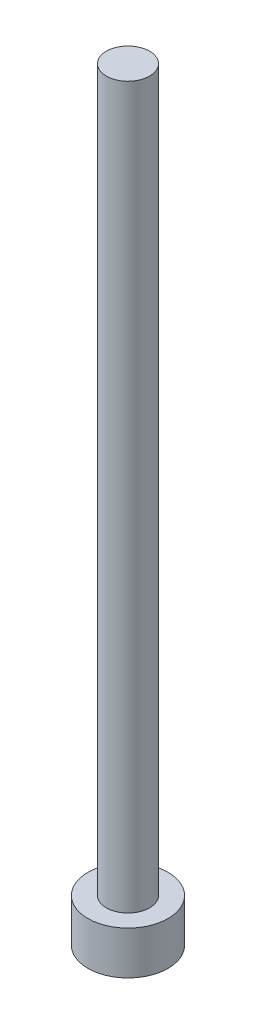
ISO-10303-21;
HEADER;
FILE_DESCRIPTION(('STEP AP214'),'2;1');
FILE_NAME('part.step','',(''),(''),'','','');
FILE_SCHEMA(('AUTOMOTIVE_DESIGN { 1 0 10303 214 1 1 1 1 }'));
ENDSEC;
DATA;
#1=APPLICATION_CONTEXT('core data for automotive mechanical design processes');
#2=APPLICATION_PROTOCOL_DEFINITION('international standard','automotive_design',2000,#1);
#3=PRODUCT_CONTEXT('',#1,'mechanical');
#4=PRODUCT('Part','Part','',(#3));
#5=PRODUCT_RELATED_PRODUCT_CATEGORY('part','',(#4));
#6=PRODUCT_DEFINITION_FORMATION('','',#4);
#7=PRODUCT_DEFINITION_CONTEXT('part definition',#1,'design');
#8=PRODUCT_DEFINITION('design','',#6,#7);
#9=PRODUCT_DEFINITION_SHAPE('','',#8);
#10=(LENGTH_UNIT() NAMED_UNIT(*) SI_UNIT(.MILLI.,.METRE.));
#11=(NAMED_UNIT(*) PLANE_ANGLE_UNIT() SI_UNIT($,.RADIAN.));
#12=(NAMED_UNIT(*) SI_UNIT($,.STERADIAN.) SOLID_ANGLE_UNIT());
#13=UNCERTAINTY_MEASURE_WITH_UNIT(LENGTH_MEASURE(1.E-05),#10,'distance_accuracy_value','');
#14=(GEOMETRIC_REPRESENTATION_CONTEXT(3) GLOBAL_UNCERTAINTY_ASSIGNED_CONTEXT((#13)) GLOBAL_UNIT_ASSIGNED_CONTEXT((#10,
#11,#12)) REPRESENTATION_CONTEXT('',''));
#15=CARTESIAN_POINT('',(0.,0.,0.));
#16=DIRECTION('',(0.,0.,1.));
#17=DIRECTION('',(1.,0.,0.));
#18=AXIS2_PLACEMENT_3D('',#15,#16,#17);
#19=CARTESIAN_POINT('',(0.,3.,0.));
#20=DIRECTION('',(0.,-1.,0.));
#21=DIRECTION('',(0.,0.,-1.));
#22=AXIS2_PLACEMENT_3D('',#19,#20,#21);
#23=CYLINDRICAL_SURFACE('',#22,2.78);
#24=CARTESIAN_POINT('',(0.,3.,0.));
#25=DIRECTION('',(0.,1.,0.));
#26=DIRECTION('',(0.,0.,1.));
#27=AXIS2_PLACEMENT_3D('',#24,#25,#26);
#28=CIRCLE('',#27,2.78);
#29=CARTESIAN_POINT('',(0.,3.,2.78));
#30=VERTEX_POINT('',#29);
#31=EDGE_CURVE('E10',#30,#30,#28,.T.);
#32=ORIENTED_EDGE('',*,*,#31,.F.);
#33=EDGE_LOOP('',(#32));
#34=FACE_BOUND('',#33,.T.);
#35=CARTESIAN_POINT('',(0.,0.,0.));
#36=DIRECTION('',(0.,1.,0.));
#37=DIRECTION('',(0.,0.,1.));
#38=AXIS2_PLACEMENT_3D('',#35,#36,#37);
#39=CIRCLE('',#38,2.78);
#40=CARTESIAN_POINT('',(0.,0.,2.78));
#41=VERTEX_POINT('',#40);
#42=EDGE_CURVE('E34',#41,#41,#39,.T.);
#43=ORIENTED_EDGE('',*,*,#42,.T.);
#44=EDGE_LOOP('',(#43));
#45=FACE_BOUND('',#44,.T.);
#46=ADVANCED_FACE('F31',(#34,#45),#23,.T.);
#47=CARTESIAN_POINT('',(0.,3.,0.));
#48=DIRECTION('',(0.,1.,0.));
#49=DIRECTION('',(0.,0.,1.));
#50=AXIS2_PLACEMENT_3D('',#47,#48,#49);
#51=PLANE('',#50);
#52=CARTESIAN_POINT('',(0.,3.,0.));
#53=DIRECTION('',(0.,1.,0.));
#54=DIRECTION('',(0.,0.,1.));
#55=AXIS2_PLACEMENT_3D('',#52,#53,#54);
#56=CIRCLE('',#55,1.5);
#57=CARTESIAN_POINT('',(0.,3.,1.5));
#58=VERTEX_POINT('',#57);
#59=EDGE_CURVE('E43',#58,#58,#56,.T.);
#60=ORIENTED_EDGE('',*,*,#59,.F.);
#61=EDGE_LOOP('',(#60));
#62=FACE_BOUND('',#61,.T.);
#63=ORIENTED_EDGE('',*,*,#31,.T.);
#64=EDGE_LOOP('',(#63));
#65=FACE_BOUND('',#64,.T.);
#66=ADVANCED_FACE('F58',(#62,#65),#51,.T.);
#67=CARTESIAN_POINT('',(0.,0.,0.));
#68=DIRECTION('',(0.,1.,0.));
#69=DIRECTION('',(0.,0.,1.));
#70=AXIS2_PLACEMENT_3D('',#67,#68,#69);
#71=PLANE('',#70);
#72=ORIENTED_EDGE('',*,*,#42,.F.);
#73=EDGE_LOOP('',(#72));
#74=FACE_BOUND('',#73,.T.);
#75=ADVANCED_FACE('F54',(#74),#71,.F.);
#76=CARTESIAN_POINT('',(0.,53.,0.));
#77=DIRECTION('',(0.,-1.,0.));
#78=DIRECTION('',(0.,0.,-1.));
#79=AXIS2_PLACEMENT_3D('',#76,#77,#78);
#80=CYLINDRICAL_SURFACE('',#79,1.5);
#81=CARTESIAN_POINT('',(0.,53.,0.));
#82=DIRECTION('',(0.,1.,0.));
#83=DIRECTION('',(0.,0.,1.));
#84=AXIS2_PLACEMENT_3D('',#81,#82,#83);
#85=CIRCLE('',#84,1.5);
#86=CARTESIAN_POINT('',(0.,53.,1.5));
#87=VERTEX_POINT('',#86);
#88=EDGE_CURVE('E41',#87,#87,#85,.T.);
#89=ORIENTED_EDGE('',*,*,#88,.F.);
#90=EDGE_LOOP('',(#89));
#91=FACE_BOUND('',#90,.T.);
#92=ORIENTED_EDGE('',*,*,#59,.T.);
#93=EDGE_LOOP('',(#92));
#94=FACE_BOUND('',#93,.T.);
#95=ADVANCED_FACE('F51',(#91,#94),#80,.T.);
#96=CARTESIAN_POINT('',(0.,53.,0.));
#97=DIRECTION('',(0.,1.,0.));
#98=DIRECTION('',(0.,0.,1.));
#99=AXIS2_PLACEMENT_3D('',#96,#97,#98);
#100=PLANE('',#99);
#101=ORIENTED_EDGE('',*,*,#88,.T.);
#102=EDGE_LOOP('',(#101));
#103=FACE_BOUND('',#102,.T.);
#104=ADVANCED_FACE('F49',(#103),#100,.T.);
#105=CLOSED_SHELL('',(#46,#66,#75,#95,#104));
#106=MANIFOLD_SOLID_BREP('B2',#105);
#107=ADVANCED_BREP_SHAPE_REPRESENTATION('',(#18,#106),#14);
#108=SHAPE_DEFINITION_REPRESENTATION(#9,#107);
ENDSEC;
END-ISO-10303-21;
